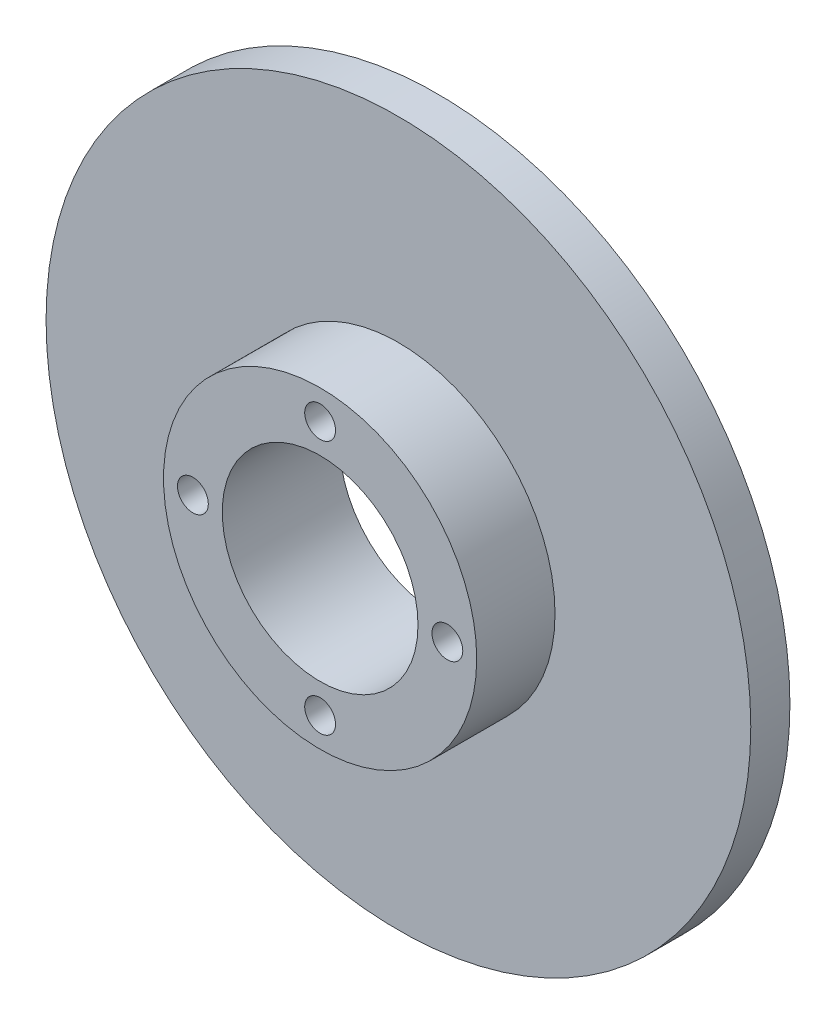
ISO-10303-21;
HEADER;
FILE_DESCRIPTION(('STEP AP214'),'2;1');
FILE_NAME('part.step','',(''),(''),'','','');
FILE_SCHEMA(('AUTOMOTIVE_DESIGN { 1 0 10303 214 1 1 1 1 }'));
ENDSEC;
DATA;
#1=APPLICATION_CONTEXT('core data for automotive mechanical design processes');
#2=APPLICATION_PROTOCOL_DEFINITION('international standard','automotive_design',2000,#1);
#3=PRODUCT_CONTEXT('',#1,'mechanical');
#4=PRODUCT('Part','Part','',(#3));
#5=PRODUCT_RELATED_PRODUCT_CATEGORY('part','',(#4));
#6=PRODUCT_DEFINITION_FORMATION('','',#4);
#7=PRODUCT_DEFINITION_CONTEXT('part definition',#1,'design');
#8=PRODUCT_DEFINITION('design','',#6,#7);
#9=PRODUCT_DEFINITION_SHAPE('','',#8);
#10=(LENGTH_UNIT() NAMED_UNIT(*) SI_UNIT(.MILLI.,.METRE.));
#11=(NAMED_UNIT(*) PLANE_ANGLE_UNIT() SI_UNIT($,.RADIAN.));
#12=(NAMED_UNIT(*) SI_UNIT($,.STERADIAN.) SOLID_ANGLE_UNIT());
#13=UNCERTAINTY_MEASURE_WITH_UNIT(LENGTH_MEASURE(1.E-05),#10,'distance_accuracy_value','');
#14=(GEOMETRIC_REPRESENTATION_CONTEXT(3) GLOBAL_UNCERTAINTY_ASSIGNED_CONTEXT((#13)) GLOBAL_UNIT_ASSIGNED_CONTEXT((#10,
#11,#12)) REPRESENTATION_CONTEXT('',''));
#15=CARTESIAN_POINT('',(0.,0.,0.));
#16=DIRECTION('',(0.,0.,1.));
#17=DIRECTION('',(1.,0.,0.));
#18=AXIS2_PLACEMENT_3D('',#15,#16,#17);
#19=CARTESIAN_POINT('',(0.,0.,12.7));
#20=DIRECTION('',(0.,0.,-1.));
#21=DIRECTION('',(-1.,0.,0.));
#22=AXIS2_PLACEMENT_3D('',#19,#20,#21);
#23=CYLINDRICAL_SURFACE('',#22,114.3);
#24=CARTESIAN_POINT('',(0.,0.,12.7));
#25=DIRECTION('',(0.,0.,1.));
#26=DIRECTION('',(1.,0.,0.));
#27=AXIS2_PLACEMENT_3D('',#24,#25,#26);
#28=CIRCLE('',#27,114.3);
#29=CARTESIAN_POINT('',(114.3,0.,12.7));
#30=VERTEX_POINT('',#29);
#31=EDGE_CURVE('E45',#30,#30,#28,.T.);
#32=ORIENTED_EDGE('',*,*,#31,.F.);
#33=EDGE_LOOP('',(#32));
#34=FACE_BOUND('',#33,.T.);
#35=CARTESIAN_POINT('',(0.,0.,0.));
#36=DIRECTION('',(0.,0.,1.));
#37=DIRECTION('',(1.,0.,0.));
#38=AXIS2_PLACEMENT_3D('',#35,#36,#37);
#39=CIRCLE('',#38,114.3);
#40=CARTESIAN_POINT('',(114.3,0.,0.));
#41=VERTEX_POINT('',#40);
#42=EDGE_CURVE('E40',#41,#41,#39,.T.);
#43=ORIENTED_EDGE('',*,*,#42,.T.);
#44=EDGE_LOOP('',(#43));
#45=FACE_BOUND('',#44,.T.);
#46=ADVANCED_FACE('F37',(#34,#45),#23,.T.);
#47=CARTESIAN_POINT('',(0.,0.,12.7));
#48=DIRECTION('',(0.,0.,1.));
#49=DIRECTION('',(1.,0.,0.));
#50=AXIS2_PLACEMENT_3D('',#47,#48,#49);
#51=PLANE('',#50);
#52=CARTESIAN_POINT('',(0.,0.,12.7));
#53=DIRECTION('',(0.,0.,1.));
#54=DIRECTION('',(1.,0.,0.));
#55=AXIS2_PLACEMENT_3D('',#52,#53,#54);
#56=CIRCLE('',#55,50.8);
#57=CARTESIAN_POINT('',(50.8,0.,12.7));
#58=VERTEX_POINT('',#57);
#59=EDGE_CURVE('E10',#58,#58,#56,.T.);
#60=ORIENTED_EDGE('',*,*,#59,.F.);
#61=EDGE_LOOP('',(#60));
#62=FACE_BOUND('',#61,.T.);
#63=ORIENTED_EDGE('',*,*,#31,.T.);
#64=EDGE_LOOP('',(#63));
#65=FACE_BOUND('',#64,.T.);
#66=ADVANCED_FACE('F122',(#62,#65),#51,.T.);
#67=CARTESIAN_POINT('',(0.,0.,0.));
#68=DIRECTION('',(0.,0.,1.));
#69=DIRECTION('',(1.,0.,0.));
#70=AXIS2_PLACEMENT_3D('',#67,#68,#69);
#71=PLANE('',#70);
#72=CARTESIAN_POINT('',(-41.275,4.32332676782251E-13,0.));
#73=DIRECTION('',(0.,0.,1.));
#74=DIRECTION('',(1.,0.,0.));
#75=AXIS2_PLACEMENT_3D('',#72,#73,#74);
#76=CIRCLE('',#75,5.);
#77=CARTESIAN_POINT('',(-36.275,4.32332676782251E-13,0.));
#78=VERTEX_POINT('',#77);
#79=EDGE_CURVE('E64',#78,#78,#76,.T.);
#80=ORIENTED_EDGE('',*,*,#79,.T.);
#81=EDGE_LOOP('',(#80));
#82=FACE_BOUND('',#81,.T.);
#83=CARTESIAN_POINT('',(0.,41.275,0.));
#84=DIRECTION('',(0.,0.,1.));
#85=DIRECTION('',(1.,0.,0.));
#86=AXIS2_PLACEMENT_3D('',#83,#84,#85);
#87=CIRCLE('',#86,5.);
#88=CARTESIAN_POINT('',(5.,41.275,0.));
#89=VERTEX_POINT('',#88);
#90=EDGE_CURVE('E68',#89,#89,#87,.T.);
#91=ORIENTED_EDGE('',*,*,#90,.T.);
#92=EDGE_LOOP('',(#91));
#93=FACE_BOUND('',#92,.T.);
#94=CARTESIAN_POINT('',(2.33104792448941E-12,-41.275,0.));
#95=DIRECTION('',(0.,0.,1.));
#96=DIRECTION('',(1.,0.,0.));
#97=AXIS2_PLACEMENT_3D('',#94,#95,#96);
#98=CIRCLE('',#97,5.0000000000025);
#99=CARTESIAN_POINT('',(5.00000000000484,-41.275,0.));
#100=VERTEX_POINT('',#99);
#101=EDGE_CURVE('E72',#100,#100,#98,.T.);
#102=ORIENTED_EDGE('',*,*,#101,.T.);
#103=EDGE_LOOP('',(#102));
#104=FACE_BOUND('',#103,.T.);
#105=CARTESIAN_POINT('',(41.275,-1.4411089226075E-13,0.));
#106=DIRECTION('',(0.,0.,1.));
#107=DIRECTION('',(1.,0.,0.));
#108=AXIS2_PLACEMENT_3D('',#105,#106,#107);
#109=CIRCLE('',#108,5.);
#110=CARTESIAN_POINT('',(46.275,-1.4411089226075E-13,0.));
#111=VERTEX_POINT('',#110);
#112=EDGE_CURVE('E76',#111,#111,#109,.T.);
#113=ORIENTED_EDGE('',*,*,#112,.T.);
#114=EDGE_LOOP('',(#113));
#115=FACE_BOUND('',#114,.T.);
#116=CARTESIAN_POINT('',(0.,0.,0.));
#117=DIRECTION('',(0.,0.,1.));
#118=DIRECTION('',(1.,0.,0.));
#119=AXIS2_PLACEMENT_3D('',#116,#117,#118);
#120=CIRCLE('',#119,31.75);
#121=CARTESIAN_POINT('',(31.75,0.,0.));
#122=VERTEX_POINT('',#121);
#123=EDGE_CURVE('E56',#122,#122,#120,.T.);
#124=ORIENTED_EDGE('',*,*,#123,.T.);
#125=EDGE_LOOP('',(#124));
#126=FACE_BOUND('',#125,.T.);
#127=ORIENTED_EDGE('',*,*,#42,.F.);
#128=EDGE_LOOP('',(#127));
#129=FACE_BOUND('',#128,.T.);
#130=ADVANCED_FACE('F117',(#82,#93,#104,#115,#126,#129),#71,.F.);
#131=CARTESIAN_POINT('',(0.,0.,38.1));
#132=DIRECTION('',(0.,0.,-1.));
#133=DIRECTION('',(-1.,0.,0.));
#134=AXIS2_PLACEMENT_3D('',#131,#132,#133);
#135=CYLINDRICAL_SURFACE('',#134,50.8);
#136=CARTESIAN_POINT('',(0.,0.,38.1));
#137=DIRECTION('',(0.,0.,1.));
#138=DIRECTION('',(1.,0.,0.));
#139=AXIS2_PLACEMENT_3D('',#136,#137,#138);
#140=CIRCLE('',#139,50.8);
#141=CARTESIAN_POINT('',(50.8,0.,38.1));
#142=VERTEX_POINT('',#141);
#143=EDGE_CURVE('E52',#142,#142,#140,.T.);
#144=ORIENTED_EDGE('',*,*,#143,.F.);
#145=EDGE_LOOP('',(#144));
#146=FACE_BOUND('',#145,.T.);
#147=ORIENTED_EDGE('',*,*,#59,.T.);
#148=EDGE_LOOP('',(#147));
#149=FACE_BOUND('',#148,.T.);
#150=ADVANCED_FACE('F104',(#146,#149),#135,.T.);
#151=CARTESIAN_POINT('',(0.,0.,38.1));
#152=DIRECTION('',(0.,0.,1.));
#153=DIRECTION('',(1.,0.,0.));
#154=AXIS2_PLACEMENT_3D('',#151,#152,#153);
#155=PLANE('',#154);
#156=CARTESIAN_POINT('',(-41.275,4.32332676782251E-13,38.1));
#157=DIRECTION('',(0.,0.,1.));
#158=DIRECTION('',(1.,0.,0.));
#159=AXIS2_PLACEMENT_3D('',#156,#157,#158);
#160=CIRCLE('',#159,5.);
#161=CARTESIAN_POINT('',(-36.275,4.32332676782251E-13,38.1));
#162=VERTEX_POINT('',#161);
#163=EDGE_CURVE('E80',#162,#162,#160,.T.);
#164=ORIENTED_EDGE('',*,*,#163,.F.);
#165=EDGE_LOOP('',(#164));
#166=FACE_BOUND('',#165,.T.);
#167=CARTESIAN_POINT('',(0.,41.275,38.1));
#168=DIRECTION('',(0.,0.,1.));
#169=DIRECTION('',(1.,0.,0.));
#170=AXIS2_PLACEMENT_3D('',#167,#168,#169);
#171=CIRCLE('',#170,5.);
#172=CARTESIAN_POINT('',(5.,41.275,38.1));
#173=VERTEX_POINT('',#172);
#174=EDGE_CURVE('E89',#173,#173,#171,.T.);
#175=ORIENTED_EDGE('',*,*,#174,.F.);
#176=EDGE_LOOP('',(#175));
#177=FACE_BOUND('',#176,.T.);
#178=CARTESIAN_POINT('',(2.33104792448941E-12,-41.275,38.1));
#179=DIRECTION('',(0.,0.,1.));
#180=DIRECTION('',(1.,0.,0.));
#181=AXIS2_PLACEMENT_3D('',#178,#179,#180);
#182=CIRCLE('',#181,5.0000000000025);
#183=CARTESIAN_POINT('',(5.00000000000484,-41.275,38.1));
#184=VERTEX_POINT('',#183);
#185=EDGE_CURVE('E85',#184,#184,#182,.T.);
#186=ORIENTED_EDGE('',*,*,#185,.F.);
#187=EDGE_LOOP('',(#186));
#188=FACE_BOUND('',#187,.T.);
#189=CARTESIAN_POINT('',(41.275,-1.4411089226075E-13,38.1));
#190=DIRECTION('',(0.,0.,1.));
#191=DIRECTION('',(1.,0.,0.));
#192=AXIS2_PLACEMENT_3D('',#189,#190,#191);
#193=CIRCLE('',#192,5.);
#194=CARTESIAN_POINT('',(46.275,-1.4411089226075E-13,38.1));
#195=VERTEX_POINT('',#194);
#196=EDGE_CURVE('E81',#195,#195,#193,.T.);
#197=ORIENTED_EDGE('',*,*,#196,.F.);
#198=EDGE_LOOP('',(#197));
#199=FACE_BOUND('',#198,.T.);
#200=CARTESIAN_POINT('',(0.,0.,38.1));
#201=DIRECTION('',(0.,0.,1.));
#202=DIRECTION('',(1.,0.,0.));
#203=AXIS2_PLACEMENT_3D('',#200,#201,#202);
#204=CIRCLE('',#203,31.75);
#205=CARTESIAN_POINT('',(31.75,0.,38.1));
#206=VERTEX_POINT('',#205);
#207=EDGE_CURVE('E60',#206,#206,#204,.T.);
#208=ORIENTED_EDGE('',*,*,#207,.F.);
#209=EDGE_LOOP('',(#208));
#210=FACE_BOUND('',#209,.T.);
#211=ORIENTED_EDGE('',*,*,#143,.T.);
#212=EDGE_LOOP('',(#211));
#213=FACE_BOUND('',#212,.T.);
#214=ADVANCED_FACE('F100',(#166,#177,#188,#199,#210,#213),#155,.T.);
#215=CARTESIAN_POINT('',(0.,0.,-80.01));
#216=DIRECTION('',(0.,0.,1.));
#217=DIRECTION('',(1.,0.,0.));
#218=AXIS2_PLACEMENT_3D('',#215,#216,#217);
#219=CYLINDRICAL_SURFACE('',#218,31.75);
#220=ORIENTED_EDGE('',*,*,#207,.T.);
#221=EDGE_LOOP('',(#220));
#222=FACE_BOUND('',#221,.T.);
#223=ORIENTED_EDGE('',*,*,#123,.F.);
#224=EDGE_LOOP('',(#223));
#225=FACE_BOUND('',#224,.T.);
#226=ADVANCED_FACE('F103',(#222,#225),#219,.F.);
#227=CARTESIAN_POINT('',(41.275,-1.4411089226075E-13,-80.01));
#228=DIRECTION('',(0.,0.,1.));
#229=DIRECTION('',(1.,0.,0.));
#230=AXIS2_PLACEMENT_3D('',#227,#228,#229);
#231=CYLINDRICAL_SURFACE('',#230,5.);
#232=ORIENTED_EDGE('',*,*,#196,.T.);
#233=EDGE_LOOP('',(#232));
#234=FACE_BOUND('',#233,.T.);
#235=ORIENTED_EDGE('',*,*,#112,.F.);
#236=EDGE_LOOP('',(#235));
#237=FACE_BOUND('',#236,.T.);
#238=ADVANCED_FACE('F160',(#234,#237),#231,.F.);
#239=CARTESIAN_POINT('',(2.33104792448941E-12,-41.275,-80.01));
#240=DIRECTION('',(0.,0.,1.));
#241=DIRECTION('',(1.,0.,0.));
#242=AXIS2_PLACEMENT_3D('',#239,#240,#241);
#243=CYLINDRICAL_SURFACE('',#242,5.0000000000025);
#244=ORIENTED_EDGE('',*,*,#185,.T.);
#245=EDGE_LOOP('',(#244));
#246=FACE_BOUND('',#245,.T.);
#247=ORIENTED_EDGE('',*,*,#101,.F.);
#248=EDGE_LOOP('',(#247));
#249=FACE_BOUND('',#248,.T.);
#250=ADVANCED_FACE('F165',(#246,#249),#243,.F.);
#251=CARTESIAN_POINT('',(0.,41.275,-80.01));
#252=DIRECTION('',(0.,0.,1.));
#253=DIRECTION('',(1.,0.,0.));
#254=AXIS2_PLACEMENT_3D('',#251,#252,#253);
#255=CYLINDRICAL_SURFACE('',#254,5.);
#256=ORIENTED_EDGE('',*,*,#174,.T.);
#257=EDGE_LOOP('',(#256));
#258=FACE_BOUND('',#257,.T.);
#259=ORIENTED_EDGE('',*,*,#90,.F.);
#260=EDGE_LOOP('',(#259));
#261=FACE_BOUND('',#260,.T.);
#262=ADVANCED_FACE('F175',(#258,#261),#255,.F.);
#263=CARTESIAN_POINT('',(-41.275,4.32332676782251E-13,-80.01));
#264=DIRECTION('',(0.,0.,1.));
#265=DIRECTION('',(1.,0.,0.));
#266=AXIS2_PLACEMENT_3D('',#263,#264,#265);
#267=CYLINDRICAL_SURFACE('',#266,5.);
#268=ORIENTED_EDGE('',*,*,#163,.T.);
#269=EDGE_LOOP('',(#268));
#270=FACE_BOUND('',#269,.T.);
#271=ORIENTED_EDGE('',*,*,#79,.F.);
#272=EDGE_LOOP('',(#271));
#273=FACE_BOUND('',#272,.T.);
#274=ADVANCED_FACE('F97',(#270,#273),#267,.F.);
#275=CLOSED_SHELL('',(#46,#66,#130,#150,#214,#226,#238,#250,#262,#274));
#276=MANIFOLD_SOLID_BREP('B2',#275);
#277=ADVANCED_BREP_SHAPE_REPRESENTATION('',(#18,#276),#14);
#278=SHAPE_DEFINITION_REPRESENTATION(#9,#277);
ENDSEC;
END-ISO-10303-21;
